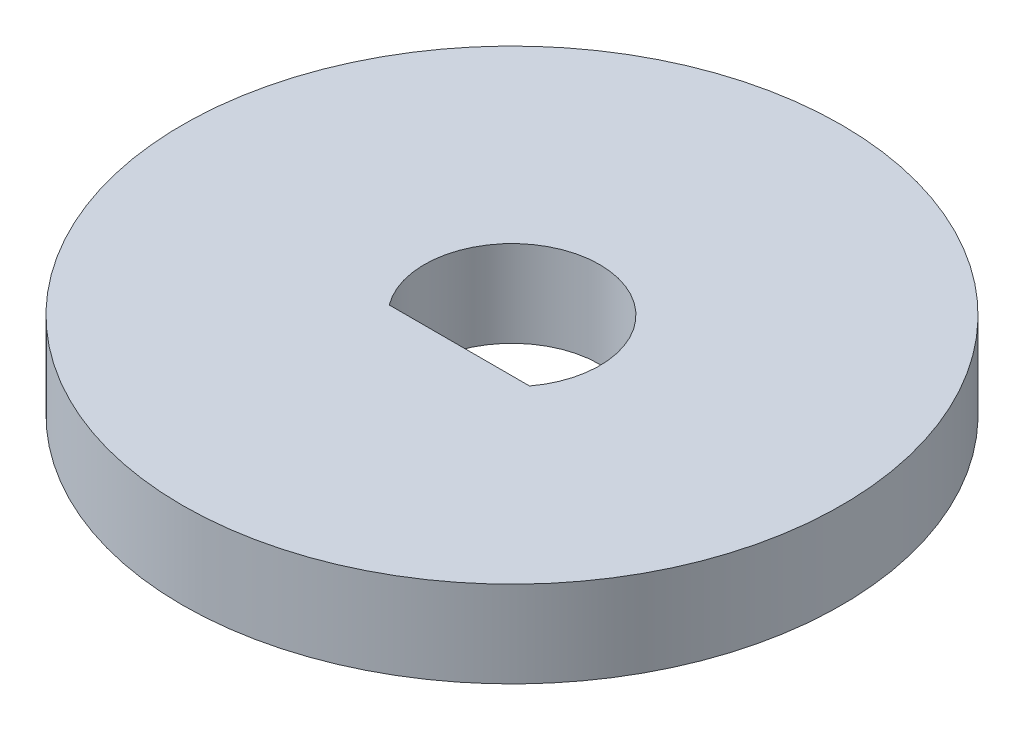
ISO-10303-21;
HEADER;
FILE_DESCRIPTION(('STEP AP214'),'2;1');
FILE_NAME('part.step','',(''),(''),'','','');
FILE_SCHEMA(('AUTOMOTIVE_DESIGN { 1 0 10303 214 1 1 1 1 }'));
ENDSEC;
DATA;
#1=APPLICATION_CONTEXT('core data for automotive mechanical design processes');
#2=APPLICATION_PROTOCOL_DEFINITION('international standard','automotive_design',2000,#1);
#3=PRODUCT_CONTEXT('',#1,'mechanical');
#4=PRODUCT('Part','Part','',(#3));
#5=PRODUCT_RELATED_PRODUCT_CATEGORY('part','',(#4));
#6=PRODUCT_DEFINITION_FORMATION('','',#4);
#7=PRODUCT_DEFINITION_CONTEXT('part definition',#1,'design');
#8=PRODUCT_DEFINITION('design','',#6,#7);
#9=PRODUCT_DEFINITION_SHAPE('','',#8);
#10=(LENGTH_UNIT() NAMED_UNIT(*) SI_UNIT(.MILLI.,.METRE.));
#11=(NAMED_UNIT(*) PLANE_ANGLE_UNIT() SI_UNIT($,.RADIAN.));
#12=(NAMED_UNIT(*) SI_UNIT($,.STERADIAN.) SOLID_ANGLE_UNIT());
#13=UNCERTAINTY_MEASURE_WITH_UNIT(LENGTH_MEASURE(1.E-05),#10,'distance_accuracy_value','');
#14=(GEOMETRIC_REPRESENTATION_CONTEXT(3) GLOBAL_UNCERTAINTY_ASSIGNED_CONTEXT((#13)) GLOBAL_UNIT_ASSIGNED_CONTEXT((#10,
#11,#12)) REPRESENTATION_CONTEXT('',''));
#15=CARTESIAN_POINT('',(0.,0.,0.));
#16=DIRECTION('',(0.,0.,1.));
#17=DIRECTION('',(1.,0.,0.));
#18=AXIS2_PLACEMENT_3D('',#15,#16,#17);
#19=CARTESIAN_POINT('',(0.,2.4638,0.));
#20=DIRECTION('',(0.,-1.,0.));
#21=DIRECTION('',(0.,0.,-1.));
#22=AXIS2_PLACEMENT_3D('',#19,#20,#21);
#23=CYLINDRICAL_SURFACE('',#22,9.398);
#24=CARTESIAN_POINT('',(0.,2.4638,0.));
#25=DIRECTION('',(0.,1.,0.));
#26=DIRECTION('',(0.,0.,1.));
#27=AXIS2_PLACEMENT_3D('',#24,#25,#26);
#28=CIRCLE('',#27,9.398);
#29=CARTESIAN_POINT('',(0.,2.4638,9.398));
#30=VERTEX_POINT('',#29);
#31=EDGE_CURVE('E11',#30,#30,#28,.T.);
#32=ORIENTED_EDGE('',*,*,#31,.F.);
#33=EDGE_LOOP('',(#32));
#34=FACE_BOUND('',#33,.T.);
#35=CARTESIAN_POINT('',(0.,0.,0.));
#36=DIRECTION('',(0.,1.,0.));
#37=DIRECTION('',(0.,0.,1.));
#38=AXIS2_PLACEMENT_3D('',#35,#36,#37);
#39=CIRCLE('',#38,9.398);
#40=CARTESIAN_POINT('',(0.,0.,9.398));
#41=VERTEX_POINT('',#40);
#42=EDGE_CURVE('E38',#41,#41,#39,.T.);
#43=ORIENTED_EDGE('',*,*,#42,.T.);
#44=EDGE_LOOP('',(#43));
#45=FACE_BOUND('',#44,.T.);
#46=ADVANCED_FACE('F35',(#34,#45),#23,.T.);
#47=CARTESIAN_POINT('',(0.,2.4638,0.));
#48=DIRECTION('',(0.,1.,0.));
#49=DIRECTION('',(0.,0.,1.));
#50=AXIS2_PLACEMENT_3D('',#47,#48,#49);
#51=PLANE('',#50);
#52=CARTESIAN_POINT('',(0.,2.4638,0.));
#53=DIRECTION('',(0.,1.,0.));
#54=DIRECTION('',(0.,0.,-1.));
#55=AXIS2_PLACEMENT_3D('',#52,#53,#54);
#56=CIRCLE('',#55,2.5);
#57=CARTESIAN_POINT('',(2.,2.4638,1.5));
#58=VERTEX_POINT('',#57);
#59=CARTESIAN_POINT('',(-2.,2.4638,1.5));
#60=VERTEX_POINT('',#59);
#61=EDGE_CURVE('E49',#58,#60,#56,.T.);
#62=ORIENTED_EDGE('',*,*,#61,.F.);
#63=DIRECTION('',(1.,0.,0.));
#64=VECTOR('',#63,1.);
#65=CARTESIAN_POINT('',(-2.,2.4638,1.5));
#66=LINE('',#65,#64);
#67=EDGE_CURVE('E68',#60,#58,#66,.T.);
#68=ORIENTED_EDGE('',*,*,#67,.F.);
#69=EDGE_LOOP('',(#62,#68));
#70=FACE_BOUND('',#69,.T.);
#71=ORIENTED_EDGE('',*,*,#31,.T.);
#72=EDGE_LOOP('',(#71));
#73=FACE_BOUND('',#72,.T.);
#74=ADVANCED_FACE('F72',(#70,#73),#51,.T.);
#75=CARTESIAN_POINT('',(0.,0.,0.));
#76=DIRECTION('',(0.,1.,0.));
#77=DIRECTION('',(0.,0.,1.));
#78=AXIS2_PLACEMENT_3D('',#75,#76,#77);
#79=PLANE('',#78);
#80=DIRECTION('',(1.,0.,0.));
#81=VECTOR('',#80,1.);
#82=CARTESIAN_POINT('',(-2.,0.,1.5));
#83=LINE('',#82,#81);
#84=CARTESIAN_POINT('',(-2.,0.,1.5));
#85=VERTEX_POINT('',#84);
#86=CARTESIAN_POINT('',(2.,0.,1.5));
#87=VERTEX_POINT('',#86);
#88=EDGE_CURVE('E76',#85,#87,#83,.T.);
#89=ORIENTED_EDGE('',*,*,#88,.T.);
#90=CARTESIAN_POINT('',(0.,0.,0.));
#91=DIRECTION('',(0.,1.,0.));
#92=DIRECTION('',(0.,0.,-1.));
#93=AXIS2_PLACEMENT_3D('',#90,#91,#92);
#94=CIRCLE('',#93,2.5);
#95=EDGE_CURVE('E54',#87,#85,#94,.T.);
#96=ORIENTED_EDGE('',*,*,#95,.T.);
#97=EDGE_LOOP('',(#89,#96));
#98=FACE_BOUND('',#97,.T.);
#99=ORIENTED_EDGE('',*,*,#42,.F.);
#100=EDGE_LOOP('',(#99));
#101=FACE_BOUND('',#100,.T.);
#102=ADVANCED_FACE('F80',(#98,#101),#79,.F.);
#103=CARTESIAN_POINT('',(0.,0.,0.));
#104=DIRECTION('',(0.,1.,0.));
#105=DIRECTION('',(0.,0.,1.));
#106=AXIS2_PLACEMENT_3D('',#103,#104,#105);
#107=CYLINDRICAL_SURFACE('',#106,2.5);
#108=ORIENTED_EDGE('',*,*,#61,.T.);
#109=DIRECTION('',(0.,1.,0.));
#110=VECTOR('',#109,1.);
#111=CARTESIAN_POINT('',(-2.,0.,1.5));
#112=LINE('',#111,#110);
#113=EDGE_CURVE('E65',#85,#60,#112,.T.);
#114=ORIENTED_EDGE('',*,*,#113,.F.);
#115=ORIENTED_EDGE('',*,*,#95,.F.);
#116=DIRECTION('',(0.,1.,0.));
#117=VECTOR('',#116,1.);
#118=CARTESIAN_POINT('',(2.,0.,1.5));
#119=LINE('',#118,#117);
#120=EDGE_CURVE('E59',#87,#58,#119,.T.);
#121=ORIENTED_EDGE('',*,*,#120,.T.);
#122=EDGE_LOOP('',(#108,#114,#115,#121));
#123=FACE_BOUND('',#122,.T.);
#124=ADVANCED_FACE('F61',(#123),#107,.F.);
#125=CARTESIAN_POINT('',(-2.,0.,1.5));
#126=DIRECTION('',(0.,0.,1.));
#127=DIRECTION('',(1.,0.,0.));
#128=AXIS2_PLACEMENT_3D('',#125,#126,#127);
#129=PLANE('',#128);
#130=ORIENTED_EDGE('',*,*,#67,.T.);
#131=ORIENTED_EDGE('',*,*,#120,.F.);
#132=ORIENTED_EDGE('',*,*,#88,.F.);
#133=ORIENTED_EDGE('',*,*,#113,.T.);
#134=EDGE_LOOP('',(#130,#131,#132,#133));
#135=FACE_BOUND('',#134,.T.);
#136=ADVANCED_FACE('F69',(#135),#129,.F.);
#137=CLOSED_SHELL('',(#46,#74,#102,#124,#136));
#138=MANIFOLD_SOLID_BREP('B2',#137);
#139=ADVANCED_BREP_SHAPE_REPRESENTATION('',(#18,#138),#14);
#140=SHAPE_DEFINITION_REPRESENTATION(#9,#139);
ENDSEC;
END-ISO-10303-21;
